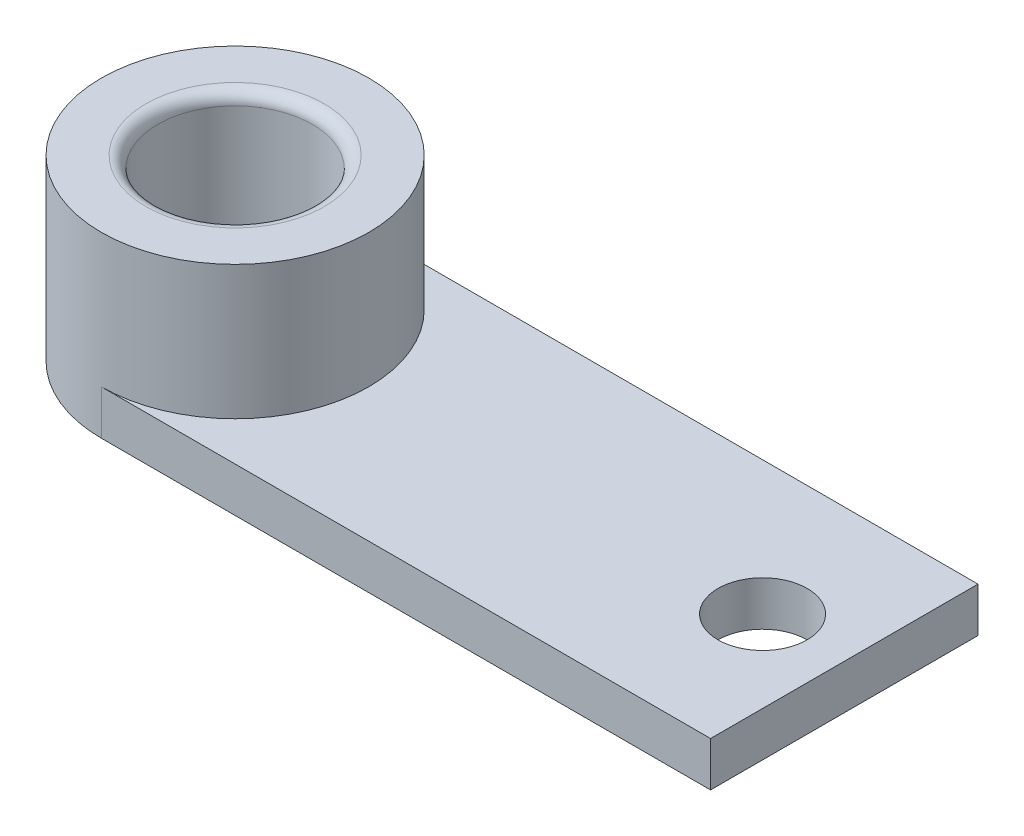
ISO-10303-21;
HEADER;
FILE_DESCRIPTION(('STEP AP214'),'2;1');
FILE_NAME('part.step','',(''),(''),'','','');
FILE_SCHEMA(('AUTOMOTIVE_DESIGN { 1 0 10303 214 1 1 1 1 }'));
ENDSEC;
DATA;
#1=APPLICATION_CONTEXT('core data for automotive mechanical design processes');
#2=APPLICATION_PROTOCOL_DEFINITION('international standard','automotive_design',2000,#1);
#3=PRODUCT_CONTEXT('',#1,'mechanical');
#4=PRODUCT('Part','Part','',(#3));
#5=PRODUCT_RELATED_PRODUCT_CATEGORY('part','',(#4));
#6=PRODUCT_DEFINITION_FORMATION('','',#4);
#7=PRODUCT_DEFINITION_CONTEXT('part definition',#1,'design');
#8=PRODUCT_DEFINITION('design','',#6,#7);
#9=PRODUCT_DEFINITION_SHAPE('','',#8);
#10=(LENGTH_UNIT() NAMED_UNIT(*) SI_UNIT(.MILLI.,.METRE.));
#11=(NAMED_UNIT(*) PLANE_ANGLE_UNIT() SI_UNIT($,.RADIAN.));
#12=(NAMED_UNIT(*) SI_UNIT($,.STERADIAN.) SOLID_ANGLE_UNIT());
#13=UNCERTAINTY_MEASURE_WITH_UNIT(LENGTH_MEASURE(1.E-05),#10,'distance_accuracy_value','');
#14=(GEOMETRIC_REPRESENTATION_CONTEXT(3) GLOBAL_UNCERTAINTY_ASSIGNED_CONTEXT((#13)) GLOBAL_UNIT_ASSIGNED_CONTEXT((#10,
#11,#12)) REPRESENTATION_CONTEXT('',''));
#15=CARTESIAN_POINT('',(0.,0.,0.));
#16=DIRECTION('',(0.,0.,1.));
#17=DIRECTION('',(1.,0.,0.));
#18=AXIS2_PLACEMENT_3D('',#15,#16,#17);
#19=CARTESIAN_POINT('',(0.,6.,0.));
#20=DIRECTION('',(0.,1.,0.));
#21=DIRECTION('',(0.,0.,1.));
#22=AXIS2_PLACEMENT_3D('',#19,#20,#21);
#23=PLANE('',#22);
#24=CARTESIAN_POINT('',(4.5,6.,-4.5));
#25=DIRECTION('',(0.,1.,0.));
#26=DIRECTION('',(0.,0.,1.));
#27=AXIS2_PLACEMENT_3D('',#24,#25,#26);
#28=CIRCLE('',#27,3.);
#29=CARTESIAN_POINT('',(4.5,6.,-1.5));
#30=VERTEX_POINT('',#29);
#31=EDGE_CURVE('E11',#30,#30,#28,.F.);
#32=ORIENTED_EDGE('',*,*,#31,.T.);
#33=EDGE_LOOP('',(#32));
#34=FACE_BOUND('',#33,.T.);
#35=CARTESIAN_POINT('',(4.5,6.,-4.5));
#36=DIRECTION('',(0.,1.,0.));
#37=DIRECTION('',(0.,0.,1.));
#38=AXIS2_PLACEMENT_3D('',#35,#36,#37);
#39=CIRCLE('',#38,4.5);
#40=CARTESIAN_POINT('',(4.5,6.,0.));
#41=VERTEX_POINT('',#40);
#42=EDGE_CURVE('E220',#41,#41,#39,.T.);
#43=ORIENTED_EDGE('',*,*,#42,.T.);
#44=EDGE_LOOP('',(#43));
#45=FACE_BOUND('',#44,.T.);
#46=ADVANCED_FACE('F33',(#34,#45),#23,.T.);
#47=CARTESIAN_POINT('',(0.,0.,0.));
#48=DIRECTION('',(0.,1.,0.));
#49=DIRECTION('',(0.,0.,1.));
#50=AXIS2_PLACEMENT_3D('',#47,#48,#49);
#51=PLANE('',#50);
#52=CARTESIAN_POINT('',(22.25,0.,-4.5));
#53=DIRECTION('',(0.,1.,0.));
#54=DIRECTION('',(0.,0.,1.));
#55=AXIS2_PLACEMENT_3D('',#52,#53,#54);
#56=CIRCLE('',#55,1.5);
#57=CARTESIAN_POINT('',(22.25,0.,-3.));
#58=VERTEX_POINT('',#57);
#59=EDGE_CURVE('E98',#58,#58,#56,.T.);
#60=ORIENTED_EDGE('',*,*,#59,.T.);
#61=EDGE_LOOP('',(#60));
#62=FACE_BOUND('',#61,.T.);
#63=DIRECTION('',(1.,0.,0.));
#64=VECTOR('',#63,1.);
#65=CARTESIAN_POINT('',(0.,0.,0.));
#66=LINE('',#65,#64);
#67=CARTESIAN_POINT('',(4.5,0.,0.));
#68=VERTEX_POINT('',#67);
#69=CARTESIAN_POINT('',(25.,0.,0.));
#70=VERTEX_POINT('',#69);
#71=EDGE_CURVE('E56',#68,#70,#66,.T.);
#72=ORIENTED_EDGE('',*,*,#71,.F.);
#73=CARTESIAN_POINT('',(4.5,0.,-4.5));
#74=DIRECTION('',(0.,1.,0.));
#75=DIRECTION('',(0.,0.,1.));
#76=AXIS2_PLACEMENT_3D('',#73,#74,#75);
#77=CIRCLE('',#76,4.5);
#78=CARTESIAN_POINT('',(4.5,0.,-9.));
#79=VERTEX_POINT('',#78);
#80=EDGE_CURVE('E77',#79,#68,#77,.T.);
#81=ORIENTED_EDGE('',*,*,#80,.F.);
#82=DIRECTION('',(-1.,0.,0.));
#83=VECTOR('',#82,1.);
#84=CARTESIAN_POINT('',(25.,0.,-9.));
#85=LINE('',#84,#83);
#86=CARTESIAN_POINT('',(25.,0.,-9.));
#87=VERTEX_POINT('',#86);
#88=EDGE_CURVE('E95',#87,#79,#85,.T.);
#89=ORIENTED_EDGE('',*,*,#88,.F.);
#90=DIRECTION('',(0.,0.,-1.));
#91=VECTOR('',#90,1.);
#92=CARTESIAN_POINT('',(25.,0.,0.));
#93=LINE('',#92,#91);
#94=EDGE_CURVE('E92',#70,#87,#93,.T.);
#95=ORIENTED_EDGE('',*,*,#94,.F.);
#96=EDGE_LOOP('',(#72,#81,#89,#95));
#97=FACE_BOUND('',#96,.T.);
#98=ADVANCED_FACE('F91',(#62,#97),#51,.F.);
#99=CARTESIAN_POINT('',(0.,6.,0.));
#100=DIRECTION('',(0.,0.,-1.));
#101=DIRECTION('',(-1.,0.,0.));
#102=AXIS2_PLACEMENT_3D('',#99,#100,#101);
#103=PLANE('',#102);
#104=DIRECTION('',(0.,1.,0.));
#105=VECTOR('',#104,1.);
#106=CARTESIAN_POINT('',(4.5,0.,0.));
#107=LINE('',#106,#105);
#108=CARTESIAN_POINT('',(4.5,1.5,0.));
#109=VERTEX_POINT('',#108);
#110=EDGE_CURVE('E80',#68,#109,#107,.T.);
#111=ORIENTED_EDGE('',*,*,#110,.F.);
#112=ORIENTED_EDGE('',*,*,#71,.T.);
#113=DIRECTION('',(0.,-1.,0.));
#114=VECTOR('',#113,1.);
#115=CARTESIAN_POINT('',(25.,6.,0.));
#116=LINE('',#115,#114);
#117=CARTESIAN_POINT('',(25.,1.5,0.));
#118=VERTEX_POINT('',#117);
#119=EDGE_CURVE('E104',#118,#70,#116,.T.);
#120=ORIENTED_EDGE('',*,*,#119,.F.);
#121=DIRECTION('',(1.,0.,0.));
#122=VECTOR('',#121,1.);
#123=CARTESIAN_POINT('',(0.,1.5,0.));
#124=LINE('',#123,#122);
#125=EDGE_CURVE('E88',#109,#118,#124,.T.);
#126=ORIENTED_EDGE('',*,*,#125,.F.);
#127=EDGE_LOOP('',(#111,#112,#120,#126));
#128=FACE_BOUND('',#127,.T.);
#129=ADVANCED_FACE('F87',(#128),#103,.F.);
#130=CARTESIAN_POINT('',(25.,6.,0.));
#131=DIRECTION('',(-1.,0.,0.));
#132=DIRECTION('',(0.,0.,1.));
#133=AXIS2_PLACEMENT_3D('',#130,#131,#132);
#134=PLANE('',#133);
#135=DIRECTION('',(0.,0.,-1.));
#136=VECTOR('',#135,1.);
#137=CARTESIAN_POINT('',(25.,1.5,0.));
#138=LINE('',#137,#136);
#139=CARTESIAN_POINT('',(25.,1.5,-9.));
#140=VERTEX_POINT('',#139);
#141=EDGE_CURVE('E235',#118,#140,#138,.T.);
#142=ORIENTED_EDGE('',*,*,#141,.F.);
#143=ORIENTED_EDGE('',*,*,#119,.T.);
#144=ORIENTED_EDGE('',*,*,#94,.T.);
#145=DIRECTION('',(0.,-1.,0.));
#146=VECTOR('',#145,1.);
#147=CARTESIAN_POINT('',(25.,6.,-9.));
#148=LINE('',#147,#146);
#149=EDGE_CURVE('E48',#140,#87,#148,.T.);
#150=ORIENTED_EDGE('',*,*,#149,.F.);
#151=EDGE_LOOP('',(#142,#143,#144,#150));
#152=FACE_BOUND('',#151,.T.);
#153=ADVANCED_FACE('F136',(#152),#134,.F.);
#154=CARTESIAN_POINT('',(25.,6.,-9.));
#155=DIRECTION('',(0.,0.,1.));
#156=DIRECTION('',(1.,0.,0.));
#157=AXIS2_PLACEMENT_3D('',#154,#155,#156);
#158=PLANE('',#157);
#159=ORIENTED_EDGE('',*,*,#88,.T.);
#160=DIRECTION('',(0.,1.,0.));
#161=VECTOR('',#160,1.);
#162=CARTESIAN_POINT('',(4.5,0.,-9.));
#163=LINE('',#162,#161);
#164=CARTESIAN_POINT('',(4.5,1.5,-9.));
#165=VERTEX_POINT('',#164);
#166=EDGE_CURVE('E82',#79,#165,#163,.T.);
#167=ORIENTED_EDGE('',*,*,#166,.T.);
#168=DIRECTION('',(-1.,0.,0.));
#169=VECTOR('',#168,1.);
#170=CARTESIAN_POINT('',(0.,1.5,-9.));
#171=LINE('',#170,#169);
#172=EDGE_CURVE('E231',#140,#165,#171,.T.);
#173=ORIENTED_EDGE('',*,*,#172,.F.);
#174=ORIENTED_EDGE('',*,*,#149,.T.);
#175=EDGE_LOOP('',(#159,#167,#173,#174));
#176=FACE_BOUND('',#175,.T.);
#177=ADVANCED_FACE('F132',(#176),#158,.F.);
#178=CARTESIAN_POINT('',(22.25,0.,-4.5));
#179=DIRECTION('',(0.,1.,0.));
#180=DIRECTION('',(0.,0.,1.));
#181=AXIS2_PLACEMENT_3D('',#178,#179,#180);
#182=CYLINDRICAL_SURFACE('',#181,1.5);
#183=ORIENTED_EDGE('',*,*,#59,.F.);
#184=EDGE_LOOP('',(#183));
#185=FACE_BOUND('',#184,.T.);
#186=CARTESIAN_POINT('',(22.25,1.5,-4.5));
#187=DIRECTION('',(0.,1.,0.));
#188=DIRECTION('',(0.,0.,1.));
#189=AXIS2_PLACEMENT_3D('',#186,#187,#188);
#190=CIRCLE('',#189,1.5);
#191=CARTESIAN_POINT('',(22.25,1.5,-3.));
#192=VERTEX_POINT('',#191);
#193=EDGE_CURVE('E226',#192,#192,#190,.F.);
#194=ORIENTED_EDGE('',*,*,#193,.F.);
#195=EDGE_LOOP('',(#194));
#196=FACE_BOUND('',#195,.T.);
#197=ADVANCED_FACE('F135',(#185,#196),#182,.F.);
#198=CARTESIAN_POINT('',(4.5,1.,-4.5));
#199=DIRECTION('',(0.,1.,0.));
#200=DIRECTION('',(0.,0.,1.));
#201=AXIS2_PLACEMENT_3D('',#198,#199,#200);
#202=CYLINDRICAL_SURFACE('',#201,2.6);
#203=CARTESIAN_POINT('',(4.5,5.6,-4.5));
#204=DIRECTION('',(0.,1.,0.));
#205=DIRECTION('',(0.,0.,1.));
#206=AXIS2_PLACEMENT_3D('',#203,#204,#205);
#207=CIRCLE('',#206,2.6);
#208=CARTESIAN_POINT('',(4.5,5.6,-1.9));
#209=VERTEX_POINT('',#208);
#210=EDGE_CURVE('E41',#209,#209,#207,.T.);
#211=ORIENTED_EDGE('',*,*,#210,.T.);
#212=EDGE_LOOP('',(#211));
#213=FACE_BOUND('',#212,.T.);
#214=CARTESIAN_POINT('',(4.5,1.,-4.5));
#215=DIRECTION('',(0.,1.,0.));
#216=DIRECTION('',(0.,0.,1.));
#217=AXIS2_PLACEMENT_3D('',#214,#215,#216);
#218=CIRCLE('',#217,2.6);
#219=CARTESIAN_POINT('',(4.5,1.,-1.9));
#220=VERTEX_POINT('',#219);
#221=EDGE_CURVE('E93',#220,#220,#218,.T.);
#222=ORIENTED_EDGE('',*,*,#221,.F.);
#223=EDGE_LOOP('',(#222));
#224=FACE_BOUND('',#223,.T.);
#225=ADVANCED_FACE('F108',(#213,#224),#202,.F.);
#226=CARTESIAN_POINT('',(4.5,1.,-4.5));
#227=DIRECTION('',(0.,1.,0.));
#228=DIRECTION('',(0.,0.,1.));
#229=AXIS2_PLACEMENT_3D('',#226,#227,#228);
#230=PLANE('',#229);
#231=ORIENTED_EDGE('',*,*,#221,.T.);
#232=EDGE_LOOP('',(#231));
#233=FACE_BOUND('',#232,.T.);
#234=ADVANCED_FACE('F167',(#233),#230,.T.);
#235=CARTESIAN_POINT('',(4.5,1.5,-4.5));
#236=DIRECTION('',(0.,1.,0.));
#237=DIRECTION('',(0.,0.,1.));
#238=AXIS2_PLACEMENT_3D('',#235,#236,#237);
#239=CYLINDRICAL_SURFACE('',#238,4.5);
#240=ORIENTED_EDGE('',*,*,#42,.F.);
#241=EDGE_LOOP('',(#240));
#242=FACE_BOUND('',#241,.T.);
#243=ORIENTED_EDGE('',*,*,#110,.T.);
#244=CARTESIAN_POINT('',(4.5,1.5,-4.5));
#245=DIRECTION('',(0.,1.,0.));
#246=DIRECTION('',(0.,0.,1.));
#247=AXIS2_PLACEMENT_3D('',#244,#245,#246);
#248=CIRCLE('',#247,4.5);
#249=EDGE_CURVE('E221',#109,#165,#248,.T.);
#250=ORIENTED_EDGE('',*,*,#249,.T.);
#251=ORIENTED_EDGE('',*,*,#166,.F.);
#252=ORIENTED_EDGE('',*,*,#80,.T.);
#253=EDGE_LOOP('',(#243,#250,#251,#252));
#254=FACE_BOUND('',#253,.T.);
#255=ADVANCED_FACE('F78',(#242,#254),#239,.T.);
#256=CARTESIAN_POINT('',(0.,1.5,0.));
#257=DIRECTION('',(0.,1.,0.));
#258=DIRECTION('',(0.,0.,1.));
#259=AXIS2_PLACEMENT_3D('',#256,#257,#258);
#260=PLANE('',#259);
#261=ORIENTED_EDGE('',*,*,#249,.F.);
#262=ORIENTED_EDGE('',*,*,#125,.T.);
#263=ORIENTED_EDGE('',*,*,#141,.T.);
#264=ORIENTED_EDGE('',*,*,#172,.T.);
#265=EDGE_LOOP('',(#261,#262,#263,#264));
#266=FACE_BOUND('',#265,.T.);
#267=ORIENTED_EDGE('',*,*,#193,.T.);
#268=EDGE_LOOP('',(#267));
#269=FACE_BOUND('',#268,.T.);
#270=ADVANCED_FACE('F112',(#266,#269),#260,.T.);
#271=CARTESIAN_POINT('',(4.5,5.6,-4.5));
#272=DIRECTION('',(0.,1.,0.));
#273=DIRECTION('',(0.,0.,1.));
#274=AXIS2_PLACEMENT_3D('',#271,#272,#273);
#275=TOROIDAL_SURFACE('',#274,3.,0.4);
#276=ORIENTED_EDGE('',*,*,#31,.F.);
#277=EDGE_LOOP('',(#276));
#278=FACE_BOUND('',#277,.T.);
#279=ORIENTED_EDGE('',*,*,#210,.F.);
#280=EDGE_LOOP('',(#279));
#281=FACE_BOUND('',#280,.T.);
#282=ADVANCED_FACE('F35',(#278,#281),#275,.T.);
#283=CLOSED_SHELL('',(#46,#98,#129,#153,#177,#197,#225,#234,#255,#270,#282));
#284=MANIFOLD_SOLID_BREP('B2',#283);
#285=ADVANCED_BREP_SHAPE_REPRESENTATION('',(#18,#284),#14);
#286=SHAPE_DEFINITION_REPRESENTATION(#9,#285);
ENDSEC;
END-ISO-10303-21;
